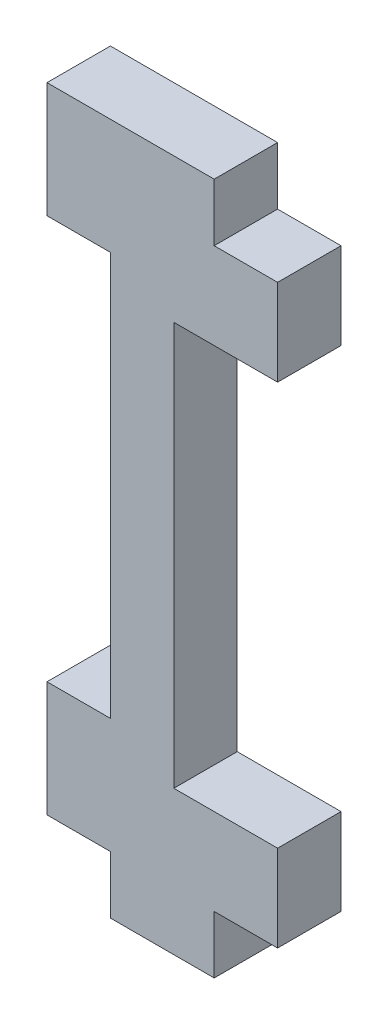
ISO-10303-21;
HEADER;
FILE_DESCRIPTION(('STEP AP214'),'2;1');
FILE_NAME('part.step','',(''),(''),'','','');
FILE_SCHEMA(('AUTOMOTIVE_DESIGN { 1 0 10303 214 1 1 1 1 }'));
ENDSEC;
DATA;
#1=APPLICATION_CONTEXT('core data for automotive mechanical design processes');
#2=APPLICATION_PROTOCOL_DEFINITION('international standard','automotive_design',2000,#1);
#3=PRODUCT_CONTEXT('',#1,'mechanical');
#4=PRODUCT('Part','Part','',(#3));
#5=PRODUCT_RELATED_PRODUCT_CATEGORY('part','',(#4));
#6=PRODUCT_DEFINITION_FORMATION('','',#4);
#7=PRODUCT_DEFINITION_CONTEXT('part definition',#1,'design');
#8=PRODUCT_DEFINITION('design','',#6,#7);
#9=PRODUCT_DEFINITION_SHAPE('','',#8);
#10=(LENGTH_UNIT() NAMED_UNIT(*) SI_UNIT(.MILLI.,.METRE.));
#11=(NAMED_UNIT(*) PLANE_ANGLE_UNIT() SI_UNIT($,.RADIAN.));
#12=(NAMED_UNIT(*) SI_UNIT($,.STERADIAN.) SOLID_ANGLE_UNIT());
#13=UNCERTAINTY_MEASURE_WITH_UNIT(LENGTH_MEASURE(1.E-05),#10,'distance_accuracy_value','');
#14=(GEOMETRIC_REPRESENTATION_CONTEXT(3) GLOBAL_UNCERTAINTY_ASSIGNED_CONTEXT((#13)) GLOBAL_UNIT_ASSIGNED_CONTEXT((#10,
#11,#12)) REPRESENTATION_CONTEXT('',''));
#15=CARTESIAN_POINT('',(0.,0.,0.));
#16=DIRECTION('',(0.,0.,1.));
#17=DIRECTION('',(1.,0.,0.));
#18=AXIS2_PLACEMENT_3D('',#15,#16,#17);
#19=CARTESIAN_POINT('',(-10.,-60.,5.5));
#20=DIRECTION('',(1.,0.,0.));
#21=DIRECTION('',(0.,0.,-1.));
#22=AXIS2_PLACEMENT_3D('',#19,#20,#21);
#23=PLANE('',#22);
#24=DIRECTION('',(0.,-1.,0.));
#25=VECTOR('',#24,1.);
#26=CARTESIAN_POINT('',(-10.,-60.,0.));
#27=LINE('',#26,#25);
#28=CARTESIAN_POINT('',(-10.,0.,0.));
#29=VERTEX_POINT('',#28);
#30=CARTESIAN_POINT('',(-10.,-10.,0.));
#31=VERTEX_POINT('',#30);
#32=EDGE_CURVE('E192',#29,#31,#27,.T.);
#33=ORIENTED_EDGE('',*,*,#32,.T.);
#34=DIRECTION('',(0.,0.,1.));
#35=VECTOR('',#34,1.);
#36=CARTESIAN_POINT('',(-10.,-10.,0.));
#37=LINE('',#36,#35);
#38=CARTESIAN_POINT('',(-10.,-10.,5.5));
#39=VERTEX_POINT('',#38);
#40=EDGE_CURVE('E213',#31,#39,#37,.T.);
#41=ORIENTED_EDGE('',*,*,#40,.T.);
#42=DIRECTION('',(0.,-1.,0.));
#43=VECTOR('',#42,1.);
#44=CARTESIAN_POINT('',(-10.,-60.,5.5));
#45=LINE('',#44,#43);
#46=CARTESIAN_POINT('',(-10.,0.,5.5));
#47=VERTEX_POINT('',#46);
#48=EDGE_CURVE('E203',#47,#39,#45,.T.);
#49=ORIENTED_EDGE('',*,*,#48,.F.);
#50=DIRECTION('',(0.,0.,-1.));
#51=VECTOR('',#50,1.);
#52=CARTESIAN_POINT('',(-10.,0.,5.5));
#53=LINE('',#52,#51);
#54=EDGE_CURVE('E11',#47,#29,#53,.T.);
#55=ORIENTED_EDGE('',*,*,#54,.T.);
#56=EDGE_LOOP('',(#33,#41,#49,#55));
#57=FACE_BOUND('',#56,.T.);
#58=ADVANCED_FACE('F33',(#57),#23,.F.);
#59=CARTESIAN_POINT('',(10.,-60.,5.5));
#60=DIRECTION('',(-1.,0.,0.));
#61=DIRECTION('',(0.,0.,1.));
#62=AXIS2_PLACEMENT_3D('',#59,#60,#61);
#63=PLANE('',#62);
#64=DIRECTION('',(0.,1.,0.));
#65=VECTOR('',#64,1.);
#66=CARTESIAN_POINT('',(10.,-60.,5.5));
#67=LINE('',#66,#65);
#68=CARTESIAN_POINT('',(10.,-12.5,5.5));
#69=VERTEX_POINT('',#68);
#70=CARTESIAN_POINT('',(10.,-5.,5.5));
#71=VERTEX_POINT('',#70);
#72=EDGE_CURVE('E197',#69,#71,#67,.T.);
#73=ORIENTED_EDGE('',*,*,#72,.F.);
#74=DIRECTION('',(0.,0.,1.));
#75=VECTOR('',#74,1.);
#76=CARTESIAN_POINT('',(10.,-12.5,0.));
#77=LINE('',#76,#75);
#78=CARTESIAN_POINT('',(10.,-12.5,0.));
#79=VERTEX_POINT('',#78);
#80=EDGE_CURVE('E238',#79,#69,#77,.T.);
#81=ORIENTED_EDGE('',*,*,#80,.F.);
#82=DIRECTION('',(0.,1.,0.));
#83=VECTOR('',#82,1.);
#84=CARTESIAN_POINT('',(10.,-60.,0.));
#85=LINE('',#84,#83);
#86=CARTESIAN_POINT('',(10.,-5.,0.));
#87=VERTEX_POINT('',#86);
#88=EDGE_CURVE('E184',#79,#87,#85,.T.);
#89=ORIENTED_EDGE('',*,*,#88,.T.);
#90=DIRECTION('',(0.,0.,1.));
#91=VECTOR('',#90,1.);
#92=CARTESIAN_POINT('',(10.,-5.,0.));
#93=LINE('',#92,#91);
#94=EDGE_CURVE('E275',#87,#71,#93,.T.);
#95=ORIENTED_EDGE('',*,*,#94,.T.);
#96=EDGE_LOOP('',(#73,#81,#89,#95));
#97=FACE_BOUND('',#96,.T.);
#98=ADVANCED_FACE('F343',(#97),#63,.F.);
#99=CARTESIAN_POINT('',(-10.,-45.,0.));
#100=VERTEX_POINT('',#99);
#101=CARTESIAN_POINT('',(-10.,-55.,0.));
#102=VERTEX_POINT('',#101);
#103=EDGE_CURVE('E195',#100,#102,#27,.T.);
#104=ORIENTED_EDGE('',*,*,#103,.T.);
#105=DIRECTION('',(0.,0.,1.));
#106=VECTOR('',#105,1.);
#107=CARTESIAN_POINT('',(-10.,-55.,0.));
#108=LINE('',#107,#106);
#109=CARTESIAN_POINT('',(-10.,-55.,5.5));
#110=VERTEX_POINT('',#109);
#111=EDGE_CURVE('E225',#102,#110,#108,.T.);
#112=ORIENTED_EDGE('',*,*,#111,.T.);
#113=CARTESIAN_POINT('',(-10.,-45.,5.5));
#114=VERTEX_POINT('',#113);
#115=EDGE_CURVE('E186',#114,#110,#45,.T.);
#116=ORIENTED_EDGE('',*,*,#115,.F.);
#117=DIRECTION('',(0.,0.,1.));
#118=VECTOR('',#117,1.);
#119=CARTESIAN_POINT('',(-10.,-45.,0.));
#120=LINE('',#119,#118);
#121=EDGE_CURVE('E206',#100,#114,#120,.T.);
#122=ORIENTED_EDGE('',*,*,#121,.F.);
#123=EDGE_LOOP('',(#104,#112,#116,#122));
#124=FACE_BOUND('',#123,.T.);
#125=ADVANCED_FACE('F35',(#124),#23,.F.);
#126=CARTESIAN_POINT('',(10.,-60.,5.5));
#127=DIRECTION('',(0.,1.,0.));
#128=DIRECTION('',(0.,0.,1.));
#129=AXIS2_PLACEMENT_3D('',#126,#127,#128);
#130=PLANE('',#129);
#131=DIRECTION('',(1.,0.,0.));
#132=VECTOR('',#131,1.);
#133=CARTESIAN_POINT('',(10.,-60.,5.5));
#134=LINE('',#133,#132);
#135=CARTESIAN_POINT('',(-4.5,-60.,5.5));
#136=VERTEX_POINT('',#135);
#137=CARTESIAN_POINT('',(4.5,-60.,5.5));
#138=VERTEX_POINT('',#137);
#139=EDGE_CURVE('E200',#136,#138,#134,.T.);
#140=ORIENTED_EDGE('',*,*,#139,.F.);
#141=DIRECTION('',(0.,0.,1.));
#142=VECTOR('',#141,1.);
#143=CARTESIAN_POINT('',(-4.5,-60.,0.));
#144=LINE('',#143,#142);
#145=CARTESIAN_POINT('',(-4.5,-60.,0.));
#146=VERTEX_POINT('',#145);
#147=EDGE_CURVE('E257',#146,#136,#144,.T.);
#148=ORIENTED_EDGE('',*,*,#147,.F.);
#149=DIRECTION('',(1.,0.,0.));
#150=VECTOR('',#149,1.);
#151=CARTESIAN_POINT('',(10.,-60.,0.));
#152=LINE('',#151,#150);
#153=CARTESIAN_POINT('',(4.5,-60.,0.));
#154=VERTEX_POINT('',#153);
#155=EDGE_CURVE('E188',#146,#154,#152,.T.);
#156=ORIENTED_EDGE('',*,*,#155,.T.);
#157=DIRECTION('',(0.,0.,1.));
#158=VECTOR('',#157,1.);
#159=CARTESIAN_POINT('',(4.5,-60.,0.));
#160=LINE('',#159,#158);
#161=EDGE_CURVE('E252',#154,#138,#160,.T.);
#162=ORIENTED_EDGE('',*,*,#161,.T.);
#163=EDGE_LOOP('',(#140,#148,#156,#162));
#164=FACE_BOUND('',#163,.T.);
#165=ADVANCED_FACE('F298',(#164),#130,.F.);
#166=CARTESIAN_POINT('',(10.,-55.,0.));
#167=VERTEX_POINT('',#166);
#168=CARTESIAN_POINT('',(10.,-47.5,0.));
#169=VERTEX_POINT('',#168);
#170=EDGE_CURVE('E173',#167,#169,#85,.T.);
#171=ORIENTED_EDGE('',*,*,#170,.T.);
#172=DIRECTION('',(0.,0.,1.));
#173=VECTOR('',#172,1.);
#174=CARTESIAN_POINT('',(10.,-47.5,0.));
#175=LINE('',#174,#173);
#176=CARTESIAN_POINT('',(10.,-47.5,5.5));
#177=VERTEX_POINT('',#176);
#178=EDGE_CURVE('E235',#169,#177,#175,.T.);
#179=ORIENTED_EDGE('',*,*,#178,.T.);
#180=CARTESIAN_POINT('',(10.,-55.,5.5));
#181=VERTEX_POINT('',#180);
#182=EDGE_CURVE('E175',#181,#177,#67,.T.);
#183=ORIENTED_EDGE('',*,*,#182,.F.);
#184=DIRECTION('',(0.,0.,1.));
#185=VECTOR('',#184,1.);
#186=CARTESIAN_POINT('',(10.,-55.,0.));
#187=LINE('',#186,#185);
#188=EDGE_CURVE('E161',#167,#181,#187,.T.);
#189=ORIENTED_EDGE('',*,*,#188,.F.);
#190=EDGE_LOOP('',(#171,#179,#183,#189));
#191=FACE_BOUND('',#190,.T.);
#192=ADVANCED_FACE('F171',(#191),#63,.F.);
#193=CARTESIAN_POINT('',(10.,0.,5.5));
#194=DIRECTION('',(0.,-1.,0.));
#195=DIRECTION('',(0.,0.,-1.));
#196=AXIS2_PLACEMENT_3D('',#193,#194,#195);
#197=PLANE('',#196);
#198=DIRECTION('',(-1.,0.,0.));
#199=VECTOR('',#198,1.);
#200=CARTESIAN_POINT('',(10.,0.,5.5));
#201=LINE('',#200,#199);
#202=CARTESIAN_POINT('',(4.5,0.,5.5));
#203=VERTEX_POINT('',#202);
#204=EDGE_CURVE('E41',#203,#47,#201,.T.);
#205=ORIENTED_EDGE('',*,*,#204,.F.);
#206=DIRECTION('',(0.,0.,1.));
#207=VECTOR('',#206,1.);
#208=CARTESIAN_POINT('',(4.5,0.,0.));
#209=LINE('',#208,#207);
#210=CARTESIAN_POINT('',(4.5,0.,0.));
#211=VERTEX_POINT('',#210);
#212=EDGE_CURVE('E270',#211,#203,#209,.T.);
#213=ORIENTED_EDGE('',*,*,#212,.F.);
#214=DIRECTION('',(-1.,0.,0.));
#215=VECTOR('',#214,1.);
#216=CARTESIAN_POINT('',(10.,0.,0.));
#217=LINE('',#216,#215);
#218=EDGE_CURVE('E183',#211,#29,#217,.T.);
#219=ORIENTED_EDGE('',*,*,#218,.T.);
#220=ORIENTED_EDGE('',*,*,#54,.F.);
#221=EDGE_LOOP('',(#205,#213,#219,#220));
#222=FACE_BOUND('',#221,.T.);
#223=ADVANCED_FACE('F331',(#222),#197,.F.);
#224=CARTESIAN_POINT('',(0.,0.,5.5));
#225=DIRECTION('',(0.,0.,1.));
#226=DIRECTION('',(1.,0.,0.));
#227=AXIS2_PLACEMENT_3D('',#224,#225,#226);
#228=PLANE('',#227);
#229=DIRECTION('',(-1.,0.,0.));
#230=VECTOR('',#229,1.);
#231=CARTESIAN_POINT('',(-10.,-55.,5.5));
#232=LINE('',#231,#230);
#233=CARTESIAN_POINT('',(-4.5,-55.,5.5));
#234=VERTEX_POINT('',#233);
#235=EDGE_CURVE('E263',#234,#110,#232,.T.);
#236=ORIENTED_EDGE('',*,*,#235,.F.);
#237=DIRECTION('',(0.,1.,0.));
#238=VECTOR('',#237,1.);
#239=CARTESIAN_POINT('',(-4.5,-55.,5.5));
#240=LINE('',#239,#238);
#241=EDGE_CURVE('E242',#136,#234,#240,.T.);
#242=ORIENTED_EDGE('',*,*,#241,.F.);
#243=ORIENTED_EDGE('',*,*,#139,.T.);
#244=DIRECTION('',(0.,-1.,0.));
#245=VECTOR('',#244,1.);
#246=CARTESIAN_POINT('',(4.5,-60.,5.5));
#247=LINE('',#246,#245);
#248=CARTESIAN_POINT('',(4.5,-55.,5.5));
#249=VERTEX_POINT('',#248);
#250=EDGE_CURVE('E166',#249,#138,#247,.T.);
#251=ORIENTED_EDGE('',*,*,#250,.F.);
#252=DIRECTION('',(-1.,0.,0.));
#253=VECTOR('',#252,1.);
#254=CARTESIAN_POINT('',(10.,-55.,5.5));
#255=LINE('',#254,#253);
#256=EDGE_CURVE('E278',#181,#249,#255,.T.);
#257=ORIENTED_EDGE('',*,*,#256,.F.);
#258=ORIENTED_EDGE('',*,*,#182,.T.);
#259=DIRECTION('',(1.,0.,0.));
#260=VECTOR('',#259,1.);
#261=CARTESIAN_POINT('',(1.,-47.5,5.5));
#262=LINE('',#261,#260);
#263=CARTESIAN_POINT('',(1.,-47.5,5.5));
#264=VERTEX_POINT('',#263);
#265=EDGE_CURVE('E247',#264,#177,#262,.T.);
#266=ORIENTED_EDGE('',*,*,#265,.F.);
#267=DIRECTION('',(0.,-1.,0.));
#268=VECTOR('',#267,1.);
#269=CARTESIAN_POINT('',(1.,-47.5,5.5));
#270=LINE('',#269,#268);
#271=CARTESIAN_POINT('',(1.,-12.5,5.5));
#272=VERTEX_POINT('',#271);
#273=EDGE_CURVE('E249',#272,#264,#270,.T.);
#274=ORIENTED_EDGE('',*,*,#273,.F.);
#275=DIRECTION('',(-1.,0.,0.));
#276=VECTOR('',#275,1.);
#277=CARTESIAN_POINT('',(1.,-12.5,5.5));
#278=LINE('',#277,#276);
#279=EDGE_CURVE('E243',#69,#272,#278,.T.);
#280=ORIENTED_EDGE('',*,*,#279,.F.);
#281=ORIENTED_EDGE('',*,*,#72,.T.);
#282=DIRECTION('',(1.,0.,0.));
#283=VECTOR('',#282,1.);
#284=CARTESIAN_POINT('',(10.,-5.,5.5));
#285=LINE('',#284,#283);
#286=CARTESIAN_POINT('',(4.5,-5.,5.5));
#287=VERTEX_POINT('',#286);
#288=EDGE_CURVE('E279',#287,#71,#285,.T.);
#289=ORIENTED_EDGE('',*,*,#288,.F.);
#290=DIRECTION('',(0.,-1.,0.));
#291=VECTOR('',#290,1.);
#292=CARTESIAN_POINT('',(4.5,0.,5.5));
#293=LINE('',#292,#291);
#294=EDGE_CURVE('E282',#203,#287,#293,.T.);
#295=ORIENTED_EDGE('',*,*,#294,.F.);
#296=ORIENTED_EDGE('',*,*,#204,.T.);
#297=ORIENTED_EDGE('',*,*,#48,.T.);
#298=DIRECTION('',(-1.,0.,0.));
#299=VECTOR('',#298,1.);
#300=CARTESIAN_POINT('',(-10.,-10.,5.5));
#301=LINE('',#300,#299);
#302=CARTESIAN_POINT('',(-4.5,-10.,5.5));
#303=VERTEX_POINT('',#302);
#304=EDGE_CURVE('E216',#303,#39,#301,.T.);
#305=ORIENTED_EDGE('',*,*,#304,.F.);
#306=DIRECTION('',(0.,1.,0.));
#307=VECTOR('',#306,1.);
#308=CARTESIAN_POINT('',(-4.5,-10.,5.5));
#309=LINE('',#308,#307);
#310=CARTESIAN_POINT('',(-4.5,-45.,5.5));
#311=VERTEX_POINT('',#310);
#312=EDGE_CURVE('E219',#311,#303,#309,.T.);
#313=ORIENTED_EDGE('',*,*,#312,.F.);
#314=DIRECTION('',(1.,0.,0.));
#315=VECTOR('',#314,1.);
#316=CARTESIAN_POINT('',(-10.,-45.,5.5));
#317=LINE('',#316,#315);
#318=EDGE_CURVE('E222',#114,#311,#317,.T.);
#319=ORIENTED_EDGE('',*,*,#318,.F.);
#320=ORIENTED_EDGE('',*,*,#115,.T.);
#321=EDGE_LOOP('',(#236,#242,#243,#251,#257,#258,#266,#274,#280,#281,#289,#295,#296,#297,#305,
#313,#319,#320));
#322=FACE_BOUND('',#321,.T.);
#323=ADVANCED_FACE('F304',(#322),#228,.T.);
#324=CARTESIAN_POINT('',(0.,0.,0.));
#325=DIRECTION('',(0.,0.,1.));
#326=DIRECTION('',(1.,0.,0.));
#327=AXIS2_PLACEMENT_3D('',#324,#325,#326);
#328=PLANE('',#327);
#329=DIRECTION('',(0.,1.,0.));
#330=VECTOR('',#329,1.);
#331=CARTESIAN_POINT('',(-4.5,-55.,0.));
#332=LINE('',#331,#330);
#333=CARTESIAN_POINT('',(-4.5,-55.,0.));
#334=VERTEX_POINT('',#333);
#335=EDGE_CURVE('E265',#146,#334,#332,.T.);
#336=ORIENTED_EDGE('',*,*,#335,.T.);
#337=DIRECTION('',(-1.,0.,0.));
#338=VECTOR('',#337,1.);
#339=CARTESIAN_POINT('',(-10.,-55.,0.));
#340=LINE('',#339,#338);
#341=EDGE_CURVE('E48',#334,#102,#340,.T.);
#342=ORIENTED_EDGE('',*,*,#341,.T.);
#343=ORIENTED_EDGE('',*,*,#103,.F.);
#344=DIRECTION('',(1.,0.,0.));
#345=VECTOR('',#344,1.);
#346=CARTESIAN_POINT('',(-10.,-45.,0.));
#347=LINE('',#346,#345);
#348=CARTESIAN_POINT('',(-4.5,-45.,0.));
#349=VERTEX_POINT('',#348);
#350=EDGE_CURVE('E218',#100,#349,#347,.T.);
#351=ORIENTED_EDGE('',*,*,#350,.T.);
#352=DIRECTION('',(0.,1.,0.));
#353=VECTOR('',#352,1.);
#354=CARTESIAN_POINT('',(-4.5,-10.,0.));
#355=LINE('',#354,#353);
#356=CARTESIAN_POINT('',(-4.5,-10.,0.));
#357=VERTEX_POINT('',#356);
#358=EDGE_CURVE('E228',#349,#357,#355,.T.);
#359=ORIENTED_EDGE('',*,*,#358,.T.);
#360=DIRECTION('',(-1.,0.,0.));
#361=VECTOR('',#360,1.);
#362=CARTESIAN_POINT('',(-10.,-10.,0.));
#363=LINE('',#362,#361);
#364=EDGE_CURVE('E209',#357,#31,#363,.T.);
#365=ORIENTED_EDGE('',*,*,#364,.T.);
#366=ORIENTED_EDGE('',*,*,#32,.F.);
#367=ORIENTED_EDGE('',*,*,#218,.F.);
#368=DIRECTION('',(0.,-1.,0.));
#369=VECTOR('',#368,1.);
#370=CARTESIAN_POINT('',(4.5,0.,0.));
#371=LINE('',#370,#369);
#372=CARTESIAN_POINT('',(4.5,-5.,0.));
#373=VERTEX_POINT('',#372);
#374=EDGE_CURVE('E281',#211,#373,#371,.T.);
#375=ORIENTED_EDGE('',*,*,#374,.T.);
#376=DIRECTION('',(1.,0.,0.));
#377=VECTOR('',#376,1.);
#378=CARTESIAN_POINT('',(10.,-5.,0.));
#379=LINE('',#378,#377);
#380=EDGE_CURVE('E273',#373,#87,#379,.T.);
#381=ORIENTED_EDGE('',*,*,#380,.T.);
#382=ORIENTED_EDGE('',*,*,#88,.F.);
#383=DIRECTION('',(-1.,0.,0.));
#384=VECTOR('',#383,1.);
#385=CARTESIAN_POINT('',(1.,-12.5,0.));
#386=LINE('',#385,#384);
#387=CARTESIAN_POINT('',(1.,-12.5,0.));
#388=VERTEX_POINT('',#387);
#389=EDGE_CURVE('E236',#79,#388,#386,.T.);
#390=ORIENTED_EDGE('',*,*,#389,.T.);
#391=DIRECTION('',(0.,-1.,0.));
#392=VECTOR('',#391,1.);
#393=CARTESIAN_POINT('',(1.,-47.5,0.));
#394=LINE('',#393,#392);
#395=CARTESIAN_POINT('',(1.,-47.5,0.));
#396=VERTEX_POINT('',#395);
#397=EDGE_CURVE('E246',#388,#396,#394,.T.);
#398=ORIENTED_EDGE('',*,*,#397,.T.);
#399=DIRECTION('',(1.,0.,0.));
#400=VECTOR('',#399,1.);
#401=CARTESIAN_POINT('',(1.,-47.5,0.));
#402=LINE('',#401,#400);
#403=EDGE_CURVE('E182',#396,#169,#402,.T.);
#404=ORIENTED_EDGE('',*,*,#403,.T.);
#405=ORIENTED_EDGE('',*,*,#170,.F.);
#406=DIRECTION('',(-1.,0.,0.));
#407=VECTOR('',#406,1.);
#408=CARTESIAN_POINT('',(10.,-55.,0.));
#409=LINE('',#408,#407);
#410=CARTESIAN_POINT('',(4.5,-55.,0.));
#411=VERTEX_POINT('',#410);
#412=EDGE_CURVE('E157',#167,#411,#409,.T.);
#413=ORIENTED_EDGE('',*,*,#412,.T.);
#414=DIRECTION('',(0.,-1.,0.));
#415=VECTOR('',#414,1.);
#416=CARTESIAN_POINT('',(4.5,-60.,0.));
#417=LINE('',#416,#415);
#418=EDGE_CURVE('E56',#411,#154,#417,.T.);
#419=ORIENTED_EDGE('',*,*,#418,.T.);
#420=ORIENTED_EDGE('',*,*,#155,.F.);
#421=EDGE_LOOP('',(#336,#342,#343,#351,#359,#365,#366,#367,#375,#381,#382,#390,#398,#404,#405,
#413,#419,#420));
#422=FACE_BOUND('',#421,.T.);
#423=ADVANCED_FACE('F179',(#422),#328,.F.);
#424=CARTESIAN_POINT('',(-10.,-10.,0.));
#425=DIRECTION('',(0.,1.,0.));
#426=DIRECTION('',(0.,0.,1.));
#427=AXIS2_PLACEMENT_3D('',#424,#425,#426);
#428=PLANE('',#427);
#429=ORIENTED_EDGE('',*,*,#304,.T.);
#430=ORIENTED_EDGE('',*,*,#40,.F.);
#431=ORIENTED_EDGE('',*,*,#364,.F.);
#432=DIRECTION('',(0.,0.,1.));
#433=VECTOR('',#432,1.);
#434=CARTESIAN_POINT('',(-4.5,-10.,0.));
#435=LINE('',#434,#433);
#436=EDGE_CURVE('E211',#357,#303,#435,.T.);
#437=ORIENTED_EDGE('',*,*,#436,.T.);
#438=EDGE_LOOP('',(#429,#430,#431,#437));
#439=FACE_BOUND('',#438,.T.);
#440=ADVANCED_FACE('F323',(#439),#428,.F.);
#441=CARTESIAN_POINT('',(-4.5,-10.,0.));
#442=DIRECTION('',(1.,0.,0.));
#443=DIRECTION('',(0.,1.,0.));
#444=AXIS2_PLACEMENT_3D('',#441,#442,#443);
#445=PLANE('',#444);
#446=ORIENTED_EDGE('',*,*,#312,.T.);
#447=ORIENTED_EDGE('',*,*,#436,.F.);
#448=ORIENTED_EDGE('',*,*,#358,.F.);
#449=DIRECTION('',(0.,0.,1.));
#450=VECTOR('',#449,1.);
#451=CARTESIAN_POINT('',(-4.5,-45.,0.));
#452=LINE('',#451,#450);
#453=EDGE_CURVE('E208',#349,#311,#452,.T.);
#454=ORIENTED_EDGE('',*,*,#453,.T.);
#455=EDGE_LOOP('',(#446,#447,#448,#454));
#456=FACE_BOUND('',#455,.T.);
#457=ADVANCED_FACE('F319',(#456),#445,.F.);
#458=CARTESIAN_POINT('',(-10.,-45.,0.));
#459=DIRECTION('',(0.,-1.,0.));
#460=DIRECTION('',(0.,0.,-1.));
#461=AXIS2_PLACEMENT_3D('',#458,#459,#460);
#462=PLANE('',#461);
#463=ORIENTED_EDGE('',*,*,#318,.T.);
#464=ORIENTED_EDGE('',*,*,#453,.F.);
#465=ORIENTED_EDGE('',*,*,#350,.F.);
#466=ORIENTED_EDGE('',*,*,#121,.T.);
#467=EDGE_LOOP('',(#463,#464,#465,#466));
#468=FACE_BOUND('',#467,.T.);
#469=ADVANCED_FACE('F316',(#468),#462,.F.);
#470=CARTESIAN_POINT('',(10.,-5.,0.));
#471=DIRECTION('',(0.,-1.,0.));
#472=DIRECTION('',(1.,0.,0.));
#473=AXIS2_PLACEMENT_3D('',#470,#471,#472);
#474=PLANE('',#473);
#475=ORIENTED_EDGE('',*,*,#288,.T.);
#476=ORIENTED_EDGE('',*,*,#94,.F.);
#477=ORIENTED_EDGE('',*,*,#380,.F.);
#478=DIRECTION('',(0.,0.,1.));
#479=VECTOR('',#478,1.);
#480=CARTESIAN_POINT('',(4.5,-5.,0.));
#481=LINE('',#480,#479);
#482=EDGE_CURVE('E272',#373,#287,#481,.T.);
#483=ORIENTED_EDGE('',*,*,#482,.T.);
#484=EDGE_LOOP('',(#475,#476,#477,#483));
#485=FACE_BOUND('',#484,.T.);
#486=ADVANCED_FACE('F340',(#485),#474,.F.);
#487=CARTESIAN_POINT('',(4.5,0.,0.));
#488=DIRECTION('',(-1.,0.,0.));
#489=DIRECTION('',(0.,-1.,0.));
#490=AXIS2_PLACEMENT_3D('',#487,#488,#489);
#491=PLANE('',#490);
#492=ORIENTED_EDGE('',*,*,#294,.T.);
#493=ORIENTED_EDGE('',*,*,#482,.F.);
#494=ORIENTED_EDGE('',*,*,#374,.F.);
#495=ORIENTED_EDGE('',*,*,#212,.T.);
#496=EDGE_LOOP('',(#492,#493,#494,#495));
#497=FACE_BOUND('',#496,.T.);
#498=ADVANCED_FACE('F336',(#497),#491,.F.);
#499=CARTESIAN_POINT('',(4.5,-60.,0.));
#500=DIRECTION('',(-1.,0.,0.));
#501=DIRECTION('',(0.,0.,1.));
#502=AXIS2_PLACEMENT_3D('',#499,#500,#501);
#503=PLANE('',#502);
#504=ORIENTED_EDGE('',*,*,#250,.T.);
#505=ORIENTED_EDGE('',*,*,#161,.F.);
#506=ORIENTED_EDGE('',*,*,#418,.F.);
#507=DIRECTION('',(0.,0.,1.));
#508=VECTOR('',#507,1.);
#509=CARTESIAN_POINT('',(4.5,-55.,0.));
#510=LINE('',#509,#508);
#511=EDGE_CURVE('E163',#411,#249,#510,.T.);
#512=ORIENTED_EDGE('',*,*,#511,.T.);
#513=EDGE_LOOP('',(#504,#505,#506,#512));
#514=FACE_BOUND('',#513,.T.);
#515=ADVANCED_FACE('F355',(#514),#503,.F.);
#516=CARTESIAN_POINT('',(10.,-55.,0.));
#517=DIRECTION('',(0.,1.,0.));
#518=DIRECTION('',(0.,0.,1.));
#519=AXIS2_PLACEMENT_3D('',#516,#517,#518);
#520=PLANE('',#519);
#521=ORIENTED_EDGE('',*,*,#256,.T.);
#522=ORIENTED_EDGE('',*,*,#511,.F.);
#523=ORIENTED_EDGE('',*,*,#412,.F.);
#524=ORIENTED_EDGE('',*,*,#188,.T.);
#525=EDGE_LOOP('',(#521,#522,#523,#524));
#526=FACE_BOUND('',#525,.T.);
#527=ADVANCED_FACE('F160',(#526),#520,.F.);
#528=CARTESIAN_POINT('',(1.,-47.5,0.));
#529=DIRECTION('',(-1.,0.,0.));
#530=DIRECTION('',(0.,0.,1.));
#531=AXIS2_PLACEMENT_3D('',#528,#529,#530);
#532=PLANE('',#531);
#533=ORIENTED_EDGE('',*,*,#273,.T.);
#534=DIRECTION('',(0.,0.,1.));
#535=VECTOR('',#534,1.);
#536=CARTESIAN_POINT('',(1.,-47.5,0.));
#537=LINE('',#536,#535);
#538=EDGE_CURVE('E233',#396,#264,#537,.T.);
#539=ORIENTED_EDGE('',*,*,#538,.F.);
#540=ORIENTED_EDGE('',*,*,#397,.F.);
#541=DIRECTION('',(0.,0.,1.));
#542=VECTOR('',#541,1.);
#543=CARTESIAN_POINT('',(1.,-12.5,0.));
#544=LINE('',#543,#542);
#545=EDGE_CURVE('E240',#388,#272,#544,.T.);
#546=ORIENTED_EDGE('',*,*,#545,.T.);
#547=EDGE_LOOP('',(#533,#539,#540,#546));
#548=FACE_BOUND('',#547,.T.);
#549=ADVANCED_FACE('F352',(#548),#532,.F.);
#550=CARTESIAN_POINT('',(1.,-12.5,0.));
#551=DIRECTION('',(0.,1.,0.));
#552=DIRECTION('',(0.,0.,1.));
#553=AXIS2_PLACEMENT_3D('',#550,#551,#552);
#554=PLANE('',#553);
#555=ORIENTED_EDGE('',*,*,#279,.T.);
#556=ORIENTED_EDGE('',*,*,#545,.F.);
#557=ORIENTED_EDGE('',*,*,#389,.F.);
#558=ORIENTED_EDGE('',*,*,#80,.T.);
#559=EDGE_LOOP('',(#555,#556,#557,#558));
#560=FACE_BOUND('',#559,.T.);
#561=ADVANCED_FACE('F349',(#560),#554,.F.);
#562=CARTESIAN_POINT('',(1.,-47.5,0.));
#563=DIRECTION('',(0.,-1.,0.));
#564=DIRECTION('',(0.,0.,-1.));
#565=AXIS2_PLACEMENT_3D('',#562,#563,#564);
#566=PLANE('',#565);
#567=ORIENTED_EDGE('',*,*,#265,.T.);
#568=ORIENTED_EDGE('',*,*,#178,.F.);
#569=ORIENTED_EDGE('',*,*,#403,.F.);
#570=ORIENTED_EDGE('',*,*,#538,.T.);
#571=EDGE_LOOP('',(#567,#568,#569,#570));
#572=FACE_BOUND('',#571,.T.);
#573=ADVANCED_FACE('F354',(#572),#566,.F.);
#574=CARTESIAN_POINT('',(-10.,-55.,0.));
#575=DIRECTION('',(0.,1.,0.));
#576=DIRECTION('',(0.,0.,1.));
#577=AXIS2_PLACEMENT_3D('',#574,#575,#576);
#578=PLANE('',#577);
#579=ORIENTED_EDGE('',*,*,#235,.T.);
#580=ORIENTED_EDGE('',*,*,#111,.F.);
#581=ORIENTED_EDGE('',*,*,#341,.F.);
#582=DIRECTION('',(0.,0.,1.));
#583=VECTOR('',#582,1.);
#584=CARTESIAN_POINT('',(-4.5,-55.,0.));
#585=LINE('',#584,#583);
#586=EDGE_CURVE('E259',#334,#234,#585,.T.);
#587=ORIENTED_EDGE('',*,*,#586,.T.);
#588=EDGE_LOOP('',(#579,#580,#581,#587));
#589=FACE_BOUND('',#588,.T.);
#590=ADVANCED_FACE('F309',(#589),#578,.F.);
#591=CARTESIAN_POINT('',(-4.5,-55.,0.));
#592=DIRECTION('',(1.,0.,0.));
#593=DIRECTION('',(0.,1.,0.));
#594=AXIS2_PLACEMENT_3D('',#591,#592,#593);
#595=PLANE('',#594);
#596=ORIENTED_EDGE('',*,*,#241,.T.);
#597=ORIENTED_EDGE('',*,*,#586,.F.);
#598=ORIENTED_EDGE('',*,*,#335,.F.);
#599=ORIENTED_EDGE('',*,*,#147,.T.);
#600=EDGE_LOOP('',(#596,#597,#598,#599));
#601=FACE_BOUND('',#600,.T.);
#602=ADVANCED_FACE('F301',(#601),#595,.F.);
#603=CLOSED_SHELL('',(#58,#98,#125,#165,#192,#223,#323,#423,#440,#457,#469,#486,#498,#515,#527,
#549,#561,#573,#590,#602));
#604=MANIFOLD_SOLID_BREP('B2',#603);
#605=ADVANCED_BREP_SHAPE_REPRESENTATION('',(#18,#604),#14);
#606=SHAPE_DEFINITION_REPRESENTATION(#9,#605);
ENDSEC;
END-ISO-10303-21;
